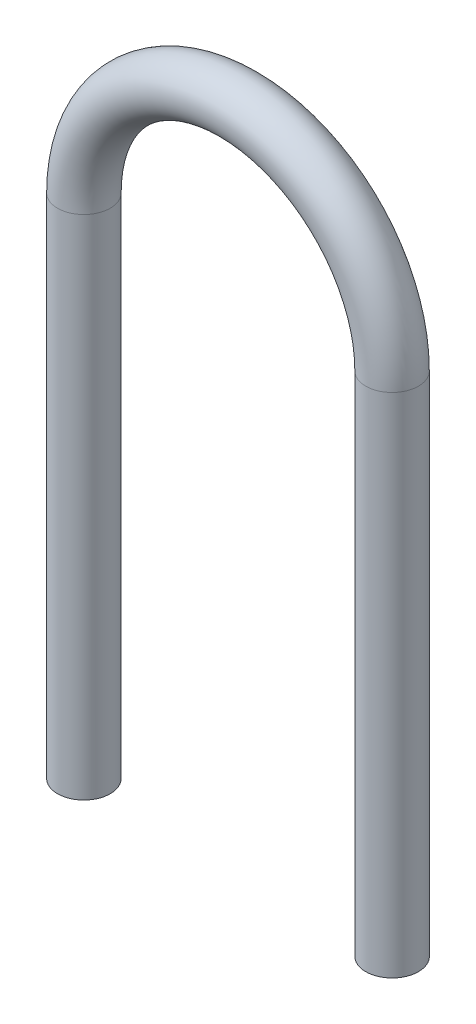
ISO-10303-21;
HEADER;
FILE_DESCRIPTION(('STEP AP214'),'2;1');
FILE_NAME('part.step','',(''),(''),'','','');
FILE_SCHEMA(('AUTOMOTIVE_DESIGN { 1 0 10303 214 1 1 1 1 }'));
ENDSEC;
DATA;
#1=APPLICATION_CONTEXT('core data for automotive mechanical design processes');
#2=APPLICATION_PROTOCOL_DEFINITION('international standard','automotive_design',2000,#1);
#3=PRODUCT_CONTEXT('',#1,'mechanical');
#4=PRODUCT('Part','Part','',(#3));
#5=PRODUCT_RELATED_PRODUCT_CATEGORY('part','',(#4));
#6=PRODUCT_DEFINITION_FORMATION('','',#4);
#7=PRODUCT_DEFINITION_CONTEXT('part definition',#1,'design');
#8=PRODUCT_DEFINITION('design','',#6,#7);
#9=PRODUCT_DEFINITION_SHAPE('','',#8);
#10=(LENGTH_UNIT() NAMED_UNIT(*) SI_UNIT(.MILLI.,.METRE.));
#11=(NAMED_UNIT(*) PLANE_ANGLE_UNIT() SI_UNIT($,.RADIAN.));
#12=(NAMED_UNIT(*) SI_UNIT($,.STERADIAN.) SOLID_ANGLE_UNIT());
#13=UNCERTAINTY_MEASURE_WITH_UNIT(LENGTH_MEASURE(1.E-05),#10,'distance_accuracy_value','');
#14=(GEOMETRIC_REPRESENTATION_CONTEXT(3) GLOBAL_UNCERTAINTY_ASSIGNED_CONTEXT((#13)) GLOBAL_UNIT_ASSIGNED_CONTEXT((#10,
#11,#12)) REPRESENTATION_CONTEXT('',''));
#15=CARTESIAN_POINT('',(0.,0.,0.));
#16=DIRECTION('',(0.,0.,1.));
#17=DIRECTION('',(1.,0.,0.));
#18=AXIS2_PLACEMENT_3D('',#15,#16,#17);
#19=CARTESIAN_POINT('',(0.,9.779,0.));
#20=DIRECTION('',(0.,-1.,0.));
#21=DIRECTION('',(0.,0.,-1.));
#22=AXIS2_PLACEMENT_3D('',#19,#20,#21);
#23=CYLINDRICAL_SURFACE('',#22,0.508);
#24=CARTESIAN_POINT('',(0.,9.779,0.));
#25=DIRECTION('',(0.,1.,0.));
#26=DIRECTION('',(0.,0.,1.));
#27=AXIS2_PLACEMENT_3D('',#24,#25,#26);
#28=CIRCLE('',#27,0.508);
#29=CARTESIAN_POINT('',(-0.508,9.779,0.));
#30=VERTEX_POINT('',#29);
#31=EDGE_CURVE('E10',#30,#30,#28,.T.);
#32=ORIENTED_EDGE('',*,*,#31,.F.);
#33=EDGE_LOOP('',(#32));
#34=FACE_BOUND('',#33,.T.);
#35=CARTESIAN_POINT('',(0.,0.,0.));
#36=DIRECTION('',(0.,1.,0.));
#37=DIRECTION('',(0.,0.,1.));
#38=AXIS2_PLACEMENT_3D('',#35,#36,#37);
#39=CIRCLE('',#38,0.508);
#40=CARTESIAN_POINT('',(0.,0.,0.508));
#41=VERTEX_POINT('',#40);
#42=EDGE_CURVE('E36',#41,#41,#39,.T.);
#43=ORIENTED_EDGE('',*,*,#42,.T.);
#44=EDGE_LOOP('',(#43));
#45=FACE_BOUND('',#44,.T.);
#46=ADVANCED_FACE('F30',(#34,#45),#23,.T.);
#47=CARTESIAN_POINT('',(0.,0.,0.));
#48=DIRECTION('',(0.,1.,0.));
#49=DIRECTION('',(0.,0.,1.));
#50=AXIS2_PLACEMENT_3D('',#47,#48,#49);
#51=PLANE('',#50);
#52=ORIENTED_EDGE('',*,*,#42,.F.);
#53=EDGE_LOOP('',(#52));
#54=FACE_BOUND('',#53,.T.);
#55=ADVANCED_FACE('F62',(#54),#51,.F.);
#56=CARTESIAN_POINT('',(2.9718,9.779,0.));
#57=DIRECTION('',(0.,0.,1.));
#58=DIRECTION('',(1.,0.,0.));
#59=AXIS2_PLACEMENT_3D('',#56,#57,#58);
#60=TOROIDAL_SURFACE('',#59,2.9718,0.508);
#61=CARTESIAN_POINT('',(5.9436,9.779,0.));
#62=DIRECTION('',(0.,-1.,0.));
#63=DIRECTION('',(0.,0.,1.));
#64=AXIS2_PLACEMENT_3D('',#61,#62,#63);
#65=CIRCLE('',#64,0.508);
#66=CARTESIAN_POINT('',(6.4516,9.779,0.));
#67=VERTEX_POINT('',#66);
#68=EDGE_CURVE('E40',#67,#67,#65,.T.);
#69=CARTESIAN_POINT('',(2.9718,9.779,0.));
#70=DIRECTION('',(0.,0.,1.));
#71=DIRECTION('',(1.,0.,0.));
#72=AXIS2_PLACEMENT_3D('',#69,#70,#71);
#73=CIRCLE('',#72,3.4798);
#74=EDGE_CURVE('',#67,#30,#73,.T.);
#75=ORIENTED_EDGE('',*,*,#68,.F.);
#76=ORIENTED_EDGE('',*,*,#31,.T.);
#77=ORIENTED_EDGE('',*,*,#74,.T.);
#78=ORIENTED_EDGE('',*,*,#74,.F.);
#79=EDGE_LOOP('',(#75,#77,#76,#78));
#80=FACE_BOUND('',#79,.T.);
#81=ADVANCED_FACE('F58',(#80),#60,.T.);
#82=CARTESIAN_POINT('',(5.9436,9.779,0.));
#83=DIRECTION('',(0.,-1.,0.));
#84=DIRECTION('',(0.,0.,-1.));
#85=AXIS2_PLACEMENT_3D('',#82,#83,#84);
#86=CYLINDRICAL_SURFACE('',#85,0.508000000000002);
#87=ORIENTED_EDGE('',*,*,#68,.T.);
#88=EDGE_LOOP('',(#87));
#89=FACE_BOUND('',#88,.T.);
#90=CARTESIAN_POINT('',(5.9436,0.,0.));
#91=DIRECTION('',(0.,1.,0.));
#92=DIRECTION('',(0.,0.,1.));
#93=AXIS2_PLACEMENT_3D('',#90,#91,#92);
#94=CIRCLE('',#93,0.508000000000002);
#95=CARTESIAN_POINT('',(5.9436,0.,0.508000000000002));
#96=VERTEX_POINT('',#95);
#97=EDGE_CURVE('E44',#96,#96,#94,.T.);
#98=ORIENTED_EDGE('',*,*,#97,.T.);
#99=EDGE_LOOP('',(#98));
#100=FACE_BOUND('',#99,.T.);
#101=ADVANCED_FACE('F50',(#89,#100),#86,.T.);
#102=CARTESIAN_POINT('',(5.9436,0.,0.));
#103=DIRECTION('',(0.,1.,0.));
#104=DIRECTION('',(0.,0.,1.));
#105=AXIS2_PLACEMENT_3D('',#102,#103,#104);
#106=PLANE('',#105);
#107=ORIENTED_EDGE('',*,*,#97,.F.);
#108=EDGE_LOOP('',(#107));
#109=FACE_BOUND('',#108,.T.);
#110=ADVANCED_FACE('F52',(#109),#106,.F.);
#111=CLOSED_SHELL('',(#46,#55,#81,#101,#110));
#112=MANIFOLD_SOLID_BREP('B2',#111);
#113=ADVANCED_BREP_SHAPE_REPRESENTATION('',(#18,#112),#14);
#114=SHAPE_DEFINITION_REPRESENTATION(#9,#113);
ENDSEC;
END-ISO-10303-21;
